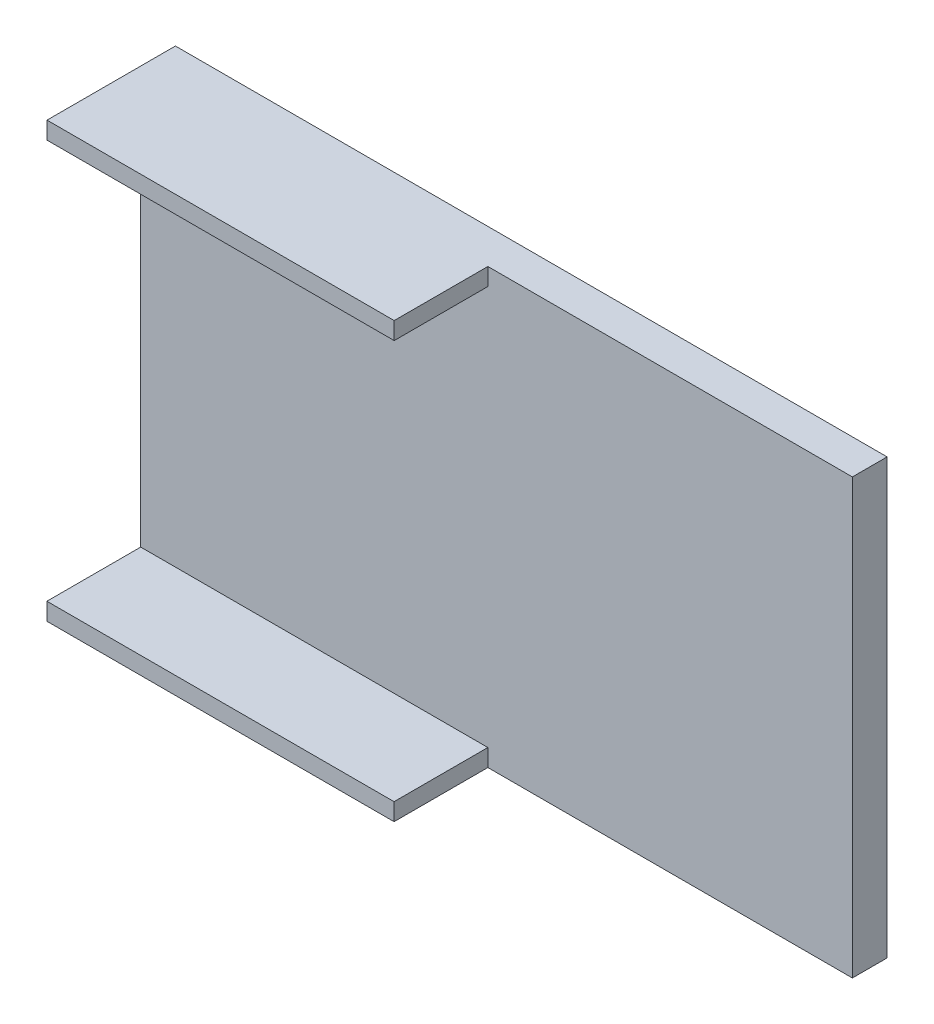
ISO-10303-21;
HEADER;
FILE_DESCRIPTION(('STEP AP214'),'2;1');
FILE_NAME('part.step','',(''),(''),'','','');
FILE_SCHEMA(('AUTOMOTIVE_DESIGN { 1 0 10303 214 1 1 1 1 }'));
ENDSEC;
DATA;
#1=APPLICATION_CONTEXT('core data for automotive mechanical design processes');
#2=APPLICATION_PROTOCOL_DEFINITION('international standard','automotive_design',2000,#1);
#3=PRODUCT_CONTEXT('',#1,'mechanical');
#4=PRODUCT('Part','Part','',(#3));
#5=PRODUCT_RELATED_PRODUCT_CATEGORY('part','',(#4));
#6=PRODUCT_DEFINITION_FORMATION('','',#4);
#7=PRODUCT_DEFINITION_CONTEXT('part definition',#1,'design');
#8=PRODUCT_DEFINITION('design','',#6,#7);
#9=PRODUCT_DEFINITION_SHAPE('','',#8);
#10=(LENGTH_UNIT() NAMED_UNIT(*) SI_UNIT(.MILLI.,.METRE.));
#11=(NAMED_UNIT(*) PLANE_ANGLE_UNIT() SI_UNIT($,.RADIAN.));
#12=(NAMED_UNIT(*) SI_UNIT($,.STERADIAN.) SOLID_ANGLE_UNIT());
#13=UNCERTAINTY_MEASURE_WITH_UNIT(LENGTH_MEASURE(1.E-05),#10,'distance_accuracy_value','');
#14=(GEOMETRIC_REPRESENTATION_CONTEXT(3) GLOBAL_UNCERTAINTY_ASSIGNED_CONTEXT((#13)) GLOBAL_UNIT_ASSIGNED_CONTEXT((#10,
#11,#12)) REPRESENTATION_CONTEXT('',''));
#15=CARTESIAN_POINT('',(0.,0.,0.));
#16=DIRECTION('',(0.,0.,1.));
#17=DIRECTION('',(1.,0.,0.));
#18=AXIS2_PLACEMENT_3D('',#15,#16,#17);
#19=CARTESIAN_POINT('',(0.,0.,2.));
#20=DIRECTION('',(0.,0.,-1.));
#21=DIRECTION('',(-1.,0.,0.));
#22=AXIS2_PLACEMENT_3D('',#19,#20,#21);
#23=PLANE('',#22);
#24=DIRECTION('',(0.,1.,0.));
#25=VECTOR('',#24,1.);
#26=CARTESIAN_POINT('',(20.1696620790405,0.348600645855762,2.));
#27=LINE('',#26,#25);
#28=CARTESIAN_POINT('',(20.1696620790405,0.348600645855762,2.));
#29=VERTEX_POINT('',#28);
#30=CARTESIAN_POINT('',(20.1696620790405,1.34860064585576,2.));
#31=VERTEX_POINT('',#30);
#32=EDGE_CURVE('E136',#29,#31,#27,.T.);
#33=ORIENTED_EDGE('',*,*,#32,.F.);
#34=DIRECTION('',(1.,0.,0.));
#35=VECTOR('',#34,1.);
#36=CARTESIAN_POINT('',(0.169662079040464,0.348600645855762,2.));
#37=LINE('',#36,#35);
#38=CARTESIAN_POINT('',(41.1696620790405,0.348600645855762,2.));
#39=VERTEX_POINT('',#38);
#40=EDGE_CURVE('E179',#29,#39,#37,.T.);
#41=ORIENTED_EDGE('',*,*,#40,.T.);
#42=DIRECTION('',(0.,-1.,0.));
#43=VECTOR('',#42,1.);
#44=CARTESIAN_POINT('',(41.1696620790405,25.3486006458558,2.));
#45=LINE('',#44,#43);
#46=CARTESIAN_POINT('',(41.1696620790405,25.3486006458558,2.));
#47=VERTEX_POINT('',#46);
#48=EDGE_CURVE('E176',#47,#39,#45,.T.);
#49=ORIENTED_EDGE('',*,*,#48,.F.);
#50=DIRECTION('',(1.,0.,0.));
#51=VECTOR('',#50,1.);
#52=CARTESIAN_POINT('',(0.169662079040461,25.3486006458558,2.));
#53=LINE('',#52,#51);
#54=CARTESIAN_POINT('',(20.1696620790405,25.3486006458558,2.));
#55=VERTEX_POINT('',#54);
#56=EDGE_CURVE('E174',#55,#47,#53,.T.);
#57=ORIENTED_EDGE('',*,*,#56,.F.);
#58=DIRECTION('',(0.,1.,0.));
#59=VECTOR('',#58,1.);
#60=CARTESIAN_POINT('',(20.1696620790405,25.3486006458558,2.));
#61=LINE('',#60,#59);
#62=CARTESIAN_POINT('',(20.1696620790405,24.3486006458558,2.));
#63=VERTEX_POINT('',#62);
#64=EDGE_CURVE('E153',#63,#55,#61,.T.);
#65=ORIENTED_EDGE('',*,*,#64,.F.);
#66=DIRECTION('',(1.,0.,0.));
#67=VECTOR('',#66,1.);
#68=CARTESIAN_POINT('',(0.169662079040461,24.3486006458558,2.));
#69=LINE('',#68,#67);
#70=CARTESIAN_POINT('',(0.169662079040461,24.3486006458558,2.));
#71=VERTEX_POINT('',#70);
#72=EDGE_CURVE('E148',#71,#63,#69,.T.);
#73=ORIENTED_EDGE('',*,*,#72,.F.);
#74=DIRECTION('',(0.,-1.,0.));
#75=VECTOR('',#74,1.);
#76=CARTESIAN_POINT('',(0.169662079040461,25.3486006458558,2.));
#77=LINE('',#76,#75);
#78=CARTESIAN_POINT('',(0.169662079040464,1.34860064585576,2.));
#79=VERTEX_POINT('',#78);
#80=EDGE_CURVE('E55',#71,#79,#77,.T.);
#81=ORIENTED_EDGE('',*,*,#80,.T.);
#82=DIRECTION('',(-1.,0.,0.));
#83=VECTOR('',#82,1.);
#84=CARTESIAN_POINT('',(0.169662079040464,1.34860064585576,2.));
#85=LINE('',#84,#83);
#86=EDGE_CURVE('E50',#31,#79,#85,.T.);
#87=ORIENTED_EDGE('',*,*,#86,.F.);
#88=EDGE_LOOP('',(#33,#41,#49,#57,#65,#73,#81,#87));
#89=FACE_BOUND('',#88,.T.);
#90=ADVANCED_FACE('F33',(#89),#23,.F.);
#91=CARTESIAN_POINT('',(0.169662079040461,25.3486006458558,2.));
#92=DIRECTION('',(0.,1.,0.));
#93=DIRECTION('',(0.,0.,1.));
#94=AXIS2_PLACEMENT_3D('',#91,#92,#93);
#95=PLANE('',#94);
#96=DIRECTION('',(1.,0.,0.));
#97=VECTOR('',#96,1.);
#98=CARTESIAN_POINT('',(0.169662079040461,25.3486006458558,0.));
#99=LINE('',#98,#97);
#100=CARTESIAN_POINT('',(0.169662079040461,25.3486006458558,0.));
#101=VERTEX_POINT('',#100);
#102=CARTESIAN_POINT('',(41.1696620790405,25.3486006458558,0.));
#103=VERTEX_POINT('',#102);
#104=EDGE_CURVE('E173',#101,#103,#99,.T.);
#105=ORIENTED_EDGE('',*,*,#104,.F.);
#106=DIRECTION('',(0.,0.,-1.));
#107=VECTOR('',#106,1.);
#108=CARTESIAN_POINT('',(0.169662079040461,25.3486006458558,2.));
#109=LINE('',#108,#107);
#110=CARTESIAN_POINT('',(0.169662079040461,25.3486006458558,7.39633400926263));
#111=VERTEX_POINT('',#110);
#112=EDGE_CURVE('E11',#111,#101,#109,.T.);
#113=ORIENTED_EDGE('',*,*,#112,.F.);
#114=DIRECTION('',(-1.,0.,0.));
#115=VECTOR('',#114,1.);
#116=CARTESIAN_POINT('',(0.169662079040461,25.3486006458558,7.39633400926263));
#117=LINE('',#116,#115);
#118=CARTESIAN_POINT('',(20.1696620790405,25.3486006458558,7.39633400926263));
#119=VERTEX_POINT('',#118);
#120=EDGE_CURVE('E157',#119,#111,#117,.T.);
#121=ORIENTED_EDGE('',*,*,#120,.F.);
#122=DIRECTION('',(0.,0.,-1.));
#123=VECTOR('',#122,1.);
#124=CARTESIAN_POINT('',(20.1696620790405,25.3486006458558,7.39633400926263));
#125=LINE('',#124,#123);
#126=EDGE_CURVE('E160',#119,#55,#125,.T.);
#127=ORIENTED_EDGE('',*,*,#126,.T.);
#128=ORIENTED_EDGE('',*,*,#56,.T.);
#129=DIRECTION('',(0.,0.,-1.));
#130=VECTOR('',#129,1.);
#131=CARTESIAN_POINT('',(41.1696620790405,25.3486006458558,2.));
#132=LINE('',#131,#130);
#133=EDGE_CURVE('E37',#47,#103,#132,.T.);
#134=ORIENTED_EDGE('',*,*,#133,.T.);
#135=EDGE_LOOP('',(#105,#113,#121,#127,#128,#134));
#136=FACE_BOUND('',#135,.T.);
#137=ADVANCED_FACE('F35',(#136),#95,.T.);
#138=CARTESIAN_POINT('',(0.169662079040461,25.3486006458558,2.));
#139=DIRECTION('',(1.,0.,0.));
#140=DIRECTION('',(0.,1.,0.));
#141=AXIS2_PLACEMENT_3D('',#138,#139,#140);
#142=PLANE('',#141);
#143=DIRECTION('',(0.,-1.,0.));
#144=VECTOR('',#143,1.);
#145=CARTESIAN_POINT('',(0.169662079040461,25.3486006458558,0.));
#146=LINE('',#145,#144);
#147=CARTESIAN_POINT('',(0.169662079040464,0.348600645855762,0.));
#148=VERTEX_POINT('',#147);
#149=EDGE_CURVE('E116',#101,#148,#146,.T.);
#150=ORIENTED_EDGE('',*,*,#149,.T.);
#151=DIRECTION('',(0.,0.,-1.));
#152=VECTOR('',#151,1.);
#153=CARTESIAN_POINT('',(0.169662079040464,0.348600645855762,2.));
#154=LINE('',#153,#152);
#155=CARTESIAN_POINT('',(0.169662079040464,0.348600645855762,7.40393570933304));
#156=VERTEX_POINT('',#155);
#157=EDGE_CURVE('E42',#156,#148,#154,.T.);
#158=ORIENTED_EDGE('',*,*,#157,.F.);
#159=DIRECTION('',(0.,-1.,0.));
#160=VECTOR('',#159,1.);
#161=CARTESIAN_POINT('',(0.169662079040464,0.348600645855762,7.40393570933304));
#162=LINE('',#161,#160);
#163=CARTESIAN_POINT('',(0.169662079040464,1.34860064585576,7.40393570933304));
#164=VERTEX_POINT('',#163);
#165=EDGE_CURVE('E114',#164,#156,#162,.T.);
#166=ORIENTED_EDGE('',*,*,#165,.F.);
#167=DIRECTION('',(0.,0.,-1.));
#168=VECTOR('',#167,1.);
#169=CARTESIAN_POINT('',(0.169662079040464,1.34860064585576,7.40393570933304));
#170=LINE('',#169,#168);
#171=EDGE_CURVE('E141',#164,#79,#170,.T.);
#172=ORIENTED_EDGE('',*,*,#171,.T.);
#173=ORIENTED_EDGE('',*,*,#80,.F.);
#174=DIRECTION('',(0.,0.,-1.));
#175=VECTOR('',#174,1.);
#176=CARTESIAN_POINT('',(0.169662079040461,24.3486006458558,7.39633400926263));
#177=LINE('',#176,#175);
#178=CARTESIAN_POINT('',(0.169662079040461,24.3486006458558,7.39633400926263));
#179=VERTEX_POINT('',#178);
#180=EDGE_CURVE('E170',#179,#71,#177,.T.);
#181=ORIENTED_EDGE('',*,*,#180,.F.);
#182=DIRECTION('',(0.,-1.,0.));
#183=VECTOR('',#182,1.);
#184=CARTESIAN_POINT('',(0.169662079040461,25.3486006458558,7.39633400926263));
#185=LINE('',#184,#183);
#186=EDGE_CURVE('E149',#111,#179,#185,.T.);
#187=ORIENTED_EDGE('',*,*,#186,.F.);
#188=ORIENTED_EDGE('',*,*,#112,.T.);
#189=EDGE_LOOP('',(#150,#158,#166,#172,#173,#181,#187,#188));
#190=FACE_BOUND('',#189,.T.);
#191=ADVANCED_FACE('F111',(#190),#142,.F.);
#192=CARTESIAN_POINT('',(0.169662079040464,0.348600645855762,2.));
#193=DIRECTION('',(0.,1.,0.));
#194=DIRECTION('',(0.,0.,1.));
#195=AXIS2_PLACEMENT_3D('',#192,#193,#194);
#196=PLANE('',#195);
#197=DIRECTION('',(1.,0.,0.));
#198=VECTOR('',#197,1.);
#199=CARTESIAN_POINT('',(0.169662079040464,0.348600645855762,0.));
#200=LINE('',#199,#198);
#201=CARTESIAN_POINT('',(41.1696620790405,0.348600645855762,0.));
#202=VERTEX_POINT('',#201);
#203=EDGE_CURVE('E187',#148,#202,#200,.T.);
#204=ORIENTED_EDGE('',*,*,#203,.T.);
#205=DIRECTION('',(0.,0.,-1.));
#206=VECTOR('',#205,1.);
#207=CARTESIAN_POINT('',(41.1696620790405,0.348600645855762,2.));
#208=LINE('',#207,#206);
#209=EDGE_CURVE('E120',#39,#202,#208,.T.);
#210=ORIENTED_EDGE('',*,*,#209,.F.);
#211=ORIENTED_EDGE('',*,*,#40,.F.);
#212=DIRECTION('',(0.,0.,-1.));
#213=VECTOR('',#212,1.);
#214=CARTESIAN_POINT('',(20.1696620790405,0.348600645855762,7.40393570933304));
#215=LINE('',#214,#213);
#216=CARTESIAN_POINT('',(20.1696620790405,0.348600645855762,7.40393570933304));
#217=VERTEX_POINT('',#216);
#218=EDGE_CURVE('E126',#217,#29,#215,.T.);
#219=ORIENTED_EDGE('',*,*,#218,.F.);
#220=DIRECTION('',(1.,0.,0.));
#221=VECTOR('',#220,1.);
#222=CARTESIAN_POINT('',(0.169662079040464,0.348600645855762,7.40393570933304));
#223=LINE('',#222,#221);
#224=EDGE_CURVE('E123',#156,#217,#223,.T.);
#225=ORIENTED_EDGE('',*,*,#224,.F.);
#226=ORIENTED_EDGE('',*,*,#157,.T.);
#227=EDGE_LOOP('',(#204,#210,#211,#219,#225,#226));
#228=FACE_BOUND('',#227,.T.);
#229=ADVANCED_FACE('F124',(#228),#196,.F.);
#230=CARTESIAN_POINT('',(41.1696620790405,25.3486006458558,2.));
#231=DIRECTION('',(1.,0.,0.));
#232=DIRECTION('',(0.,1.,0.));
#233=AXIS2_PLACEMENT_3D('',#230,#231,#232);
#234=PLANE('',#233);
#235=DIRECTION('',(0.,-1.,0.));
#236=VECTOR('',#235,1.);
#237=CARTESIAN_POINT('',(41.1696620790405,25.3486006458558,0.));
#238=LINE('',#237,#236);
#239=EDGE_CURVE('E184',#103,#202,#238,.T.);
#240=ORIENTED_EDGE('',*,*,#239,.F.);
#241=ORIENTED_EDGE('',*,*,#133,.F.);
#242=ORIENTED_EDGE('',*,*,#48,.T.);
#243=ORIENTED_EDGE('',*,*,#209,.T.);
#244=EDGE_LOOP('',(#240,#241,#242,#243));
#245=FACE_BOUND('',#244,.T.);
#246=ADVANCED_FACE('F196',(#245),#234,.T.);
#247=CARTESIAN_POINT('',(0.,0.,0.));
#248=DIRECTION('',(0.,0.,-1.));
#249=DIRECTION('',(-1.,0.,0.));
#250=AXIS2_PLACEMENT_3D('',#247,#248,#249);
#251=PLANE('',#250);
#252=ORIENTED_EDGE('',*,*,#104,.T.);
#253=ORIENTED_EDGE('',*,*,#239,.T.);
#254=ORIENTED_EDGE('',*,*,#203,.F.);
#255=ORIENTED_EDGE('',*,*,#149,.F.);
#256=EDGE_LOOP('',(#252,#253,#254,#255));
#257=FACE_BOUND('',#256,.T.);
#258=ADVANCED_FACE('F198',(#257),#251,.T.);
#259=CARTESIAN_POINT('',(0.169662079040461,24.3486006458558,7.39633400926263));
#260=DIRECTION('',(0.,1.,0.));
#261=DIRECTION('',(0.,0.,1.));
#262=AXIS2_PLACEMENT_3D('',#259,#260,#261);
#263=PLANE('',#262);
#264=ORIENTED_EDGE('',*,*,#72,.T.);
#265=DIRECTION('',(0.,0.,-1.));
#266=VECTOR('',#265,1.);
#267=CARTESIAN_POINT('',(20.1696620790405,24.3486006458558,7.39633400926263));
#268=LINE('',#267,#266);
#269=CARTESIAN_POINT('',(20.1696620790405,24.3486006458558,7.39633400926263));
#270=VERTEX_POINT('',#269);
#271=EDGE_CURVE('E167',#270,#63,#268,.T.);
#272=ORIENTED_EDGE('',*,*,#271,.F.);
#273=DIRECTION('',(1.,0.,0.));
#274=VECTOR('',#273,1.);
#275=CARTESIAN_POINT('',(0.169662079040461,24.3486006458558,7.39633400926263));
#276=LINE('',#275,#274);
#277=EDGE_CURVE('E152',#179,#270,#276,.T.);
#278=ORIENTED_EDGE('',*,*,#277,.F.);
#279=ORIENTED_EDGE('',*,*,#180,.T.);
#280=EDGE_LOOP('',(#264,#272,#278,#279));
#281=FACE_BOUND('',#280,.T.);
#282=ADVANCED_FACE('F207',(#281),#263,.F.);
#283=CARTESIAN_POINT('',(20.1696620790405,25.3486006458558,7.39633400926263));
#284=DIRECTION('',(-1.,0.,0.));
#285=DIRECTION('',(0.,0.,1.));
#286=AXIS2_PLACEMENT_3D('',#283,#284,#285);
#287=PLANE('',#286);
#288=ORIENTED_EDGE('',*,*,#64,.T.);
#289=ORIENTED_EDGE('',*,*,#126,.F.);
#290=DIRECTION('',(0.,1.,0.));
#291=VECTOR('',#290,1.);
#292=CARTESIAN_POINT('',(20.1696620790405,25.3486006458558,7.39633400926263));
#293=LINE('',#292,#291);
#294=EDGE_CURVE('E155',#270,#119,#293,.T.);
#295=ORIENTED_EDGE('',*,*,#294,.F.);
#296=ORIENTED_EDGE('',*,*,#271,.T.);
#297=EDGE_LOOP('',(#288,#289,#295,#296));
#298=FACE_BOUND('',#297,.T.);
#299=ADVANCED_FACE('F215',(#298),#287,.F.);
#300=CARTESIAN_POINT('',(0.,0.,7.39633400926263));
#301=DIRECTION('',(0.,0.,1.));
#302=DIRECTION('',(1.,0.,0.));
#303=AXIS2_PLACEMENT_3D('',#300,#301,#302);
#304=PLANE('',#303);
#305=ORIENTED_EDGE('',*,*,#186,.T.);
#306=ORIENTED_EDGE('',*,*,#277,.T.);
#307=ORIENTED_EDGE('',*,*,#294,.T.);
#308=ORIENTED_EDGE('',*,*,#120,.T.);
#309=EDGE_LOOP('',(#305,#306,#307,#308));
#310=FACE_BOUND('',#309,.T.);
#311=ADVANCED_FACE('F211',(#310),#304,.T.);
#312=CARTESIAN_POINT('',(20.1696620790405,0.348600645855762,7.40393570933304));
#313=DIRECTION('',(-1.,0.,0.));
#314=DIRECTION('',(0.,0.,1.));
#315=AXIS2_PLACEMENT_3D('',#312,#313,#314);
#316=PLANE('',#315);
#317=ORIENTED_EDGE('',*,*,#32,.T.);
#318=DIRECTION('',(0.,0.,-1.));
#319=VECTOR('',#318,1.);
#320=CARTESIAN_POINT('',(20.1696620790405,1.34860064585576,7.40393570933304));
#321=LINE('',#320,#319);
#322=CARTESIAN_POINT('',(20.1696620790405,1.34860064585576,7.40393570933304));
#323=VERTEX_POINT('',#322);
#324=EDGE_CURVE('E144',#323,#31,#321,.T.);
#325=ORIENTED_EDGE('',*,*,#324,.F.);
#326=DIRECTION('',(0.,1.,0.));
#327=VECTOR('',#326,1.);
#328=CARTESIAN_POINT('',(20.1696620790405,0.348600645855762,7.40393570933304));
#329=LINE('',#328,#327);
#330=EDGE_CURVE('E129',#217,#323,#329,.T.);
#331=ORIENTED_EDGE('',*,*,#330,.F.);
#332=ORIENTED_EDGE('',*,*,#218,.T.);
#333=EDGE_LOOP('',(#317,#325,#331,#332));
#334=FACE_BOUND('',#333,.T.);
#335=ADVANCED_FACE('F201',(#334),#316,.F.);
#336=CARTESIAN_POINT('',(0.169662079040464,1.34860064585576,7.40393570933304));
#337=DIRECTION('',(0.,-1.,0.));
#338=DIRECTION('',(0.,0.,-1.));
#339=AXIS2_PLACEMENT_3D('',#336,#337,#338);
#340=PLANE('',#339);
#341=ORIENTED_EDGE('',*,*,#86,.T.);
#342=ORIENTED_EDGE('',*,*,#171,.F.);
#343=DIRECTION('',(-1.,0.,0.));
#344=VECTOR('',#343,1.);
#345=CARTESIAN_POINT('',(0.169662079040464,1.34860064585576,7.40393570933304));
#346=LINE('',#345,#344);
#347=EDGE_CURVE('E133',#323,#164,#346,.T.);
#348=ORIENTED_EDGE('',*,*,#347,.F.);
#349=ORIENTED_EDGE('',*,*,#324,.T.);
#350=EDGE_LOOP('',(#341,#342,#348,#349));
#351=FACE_BOUND('',#350,.T.);
#352=ADVANCED_FACE('F203',(#351),#340,.F.);
#353=CARTESIAN_POINT('',(0.,0.,7.40393570933304));
#354=DIRECTION('',(0.,0.,-1.));
#355=DIRECTION('',(-1.,0.,0.));
#356=AXIS2_PLACEMENT_3D('',#353,#354,#355);
#357=PLANE('',#356);
#358=ORIENTED_EDGE('',*,*,#165,.T.);
#359=ORIENTED_EDGE('',*,*,#224,.T.);
#360=ORIENTED_EDGE('',*,*,#330,.T.);
#361=ORIENTED_EDGE('',*,*,#347,.T.);
#362=EDGE_LOOP('',(#358,#359,#360,#361));
#363=FACE_BOUND('',#362,.T.);
#364=ADVANCED_FACE('F131',(#363),#357,.F.);
#365=CLOSED_SHELL('',(#90,#137,#191,#229,#246,#258,#282,#299,#311,#335,#352,#364));
#366=MANIFOLD_SOLID_BREP('B2',#365);
#367=ADVANCED_BREP_SHAPE_REPRESENTATION('',(#18,#366),#14);
#368=SHAPE_DEFINITION_REPRESENTATION(#9,#367);
ENDSEC;
END-ISO-10303-21;
